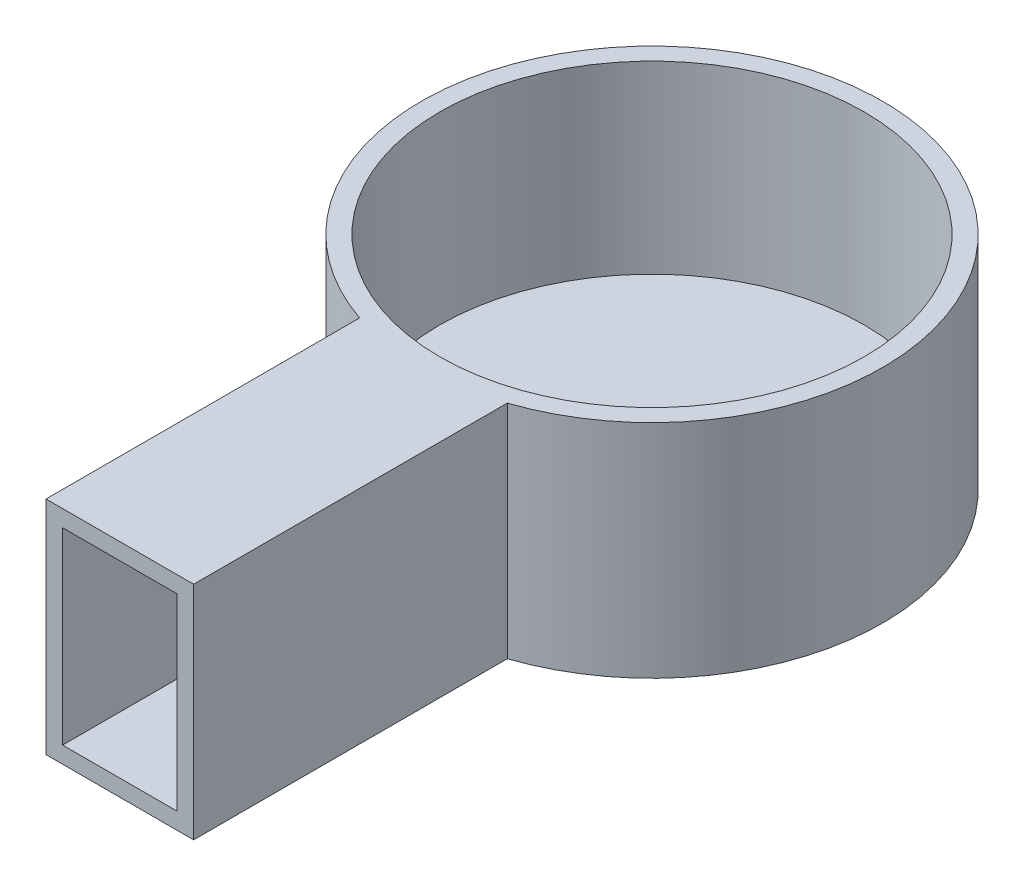
ISO-10303-21;
HEADER;
FILE_DESCRIPTION(('STEP AP214'),'2;1');
FILE_NAME('part.step','',(''),(''),'','','');
FILE_SCHEMA(('AUTOMOTIVE_DESIGN { 1 0 10303 214 1 1 1 1 }'));
ENDSEC;
DATA;
#1=APPLICATION_CONTEXT('core data for automotive mechanical design processes');
#2=APPLICATION_PROTOCOL_DEFINITION('international standard','automotive_design',2000,#1);
#3=PRODUCT_CONTEXT('',#1,'mechanical');
#4=PRODUCT('Part','Part','',(#3));
#5=PRODUCT_RELATED_PRODUCT_CATEGORY('part','',(#4));
#6=PRODUCT_DEFINITION_FORMATION('','',#4);
#7=PRODUCT_DEFINITION_CONTEXT('part definition',#1,'design');
#8=PRODUCT_DEFINITION('design','',#6,#7);
#9=PRODUCT_DEFINITION_SHAPE('','',#8);
#10=(LENGTH_UNIT() NAMED_UNIT(*) SI_UNIT(.MILLI.,.METRE.));
#11=(NAMED_UNIT(*) PLANE_ANGLE_UNIT() SI_UNIT($,.RADIAN.));
#12=(NAMED_UNIT(*) SI_UNIT($,.STERADIAN.) SOLID_ANGLE_UNIT());
#13=UNCERTAINTY_MEASURE_WITH_UNIT(LENGTH_MEASURE(1.E-05),#10,'distance_accuracy_value','');
#14=(GEOMETRIC_REPRESENTATION_CONTEXT(3) GLOBAL_UNCERTAINTY_ASSIGNED_CONTEXT((#13)) GLOBAL_UNIT_ASSIGNED_CONTEXT((#10,
#11,#12)) REPRESENTATION_CONTEXT('',''));
#15=CARTESIAN_POINT('',(0.,0.,0.));
#16=DIRECTION('',(0.,0.,1.));
#17=DIRECTION('',(1.,0.,0.));
#18=AXIS2_PLACEMENT_3D('',#15,#16,#17);
#19=CARTESIAN_POINT('',(-4.,-6.,17.));
#20=DIRECTION('',(1.,0.,0.));
#21=DIRECTION('',(0.,0.,-1.));
#22=AXIS2_PLACEMENT_3D('',#19,#20,#21);
#23=PLANE('',#22);
#24=DIRECTION('',(0.,-1.,0.));
#25=VECTOR('',#24,1.);
#26=CARTESIAN_POINT('',(-4.,-6.,0.));
#27=LINE('',#26,#25);
#28=CARTESIAN_POINT('',(-4.,6.,0.));
#29=VERTEX_POINT('',#28);
#30=CARTESIAN_POINT('',(-4.,-6.,0.));
#31=VERTEX_POINT('',#30);
#32=EDGE_CURVE('E121',#29,#31,#27,.T.);
#33=ORIENTED_EDGE('',*,*,#32,.T.);
#34=DIRECTION('',(0.,0.,-1.));
#35=VECTOR('',#34,1.);
#36=CARTESIAN_POINT('',(-4.,-6.,17.));
#37=LINE('',#36,#35);
#38=CARTESIAN_POINT('',(-4.,-6.,17.));
#39=VERTEX_POINT('',#38);
#40=EDGE_CURVE('E11',#39,#31,#37,.T.);
#41=ORIENTED_EDGE('',*,*,#40,.F.);
#42=DIRECTION('',(0.,-1.,0.));
#43=VECTOR('',#42,1.);
#44=CARTESIAN_POINT('',(-4.,-6.,17.));
#45=LINE('',#44,#43);
#46=CARTESIAN_POINT('',(-4.,6.,17.));
#47=VERTEX_POINT('',#46);
#48=EDGE_CURVE('E103',#47,#39,#45,.T.);
#49=ORIENTED_EDGE('',*,*,#48,.F.);
#50=DIRECTION('',(0.,0.,-1.));
#51=VECTOR('',#50,1.);
#52=CARTESIAN_POINT('',(-4.,6.,17.));
#53=LINE('',#52,#51);
#54=EDGE_CURVE('E117',#47,#29,#53,.T.);
#55=ORIENTED_EDGE('',*,*,#54,.T.);
#56=EDGE_LOOP('',(#33,#41,#49,#55));
#57=FACE_BOUND('',#56,.T.);
#58=ADVANCED_FACE('F34',(#57),#23,.F.);
#59=CARTESIAN_POINT('',(4.,-6.,17.));
#60=DIRECTION('',(0.,1.,0.));
#61=DIRECTION('',(-1.,0.,0.));
#62=AXIS2_PLACEMENT_3D('',#59,#60,#61);
#63=PLANE('',#62);
#64=ORIENTED_EDGE('',*,*,#40,.T.);
#65=CARTESIAN_POINT('',(0.,-6.,-11.842719282327));
#66=DIRECTION('',(0.,1.,0.));
#67=DIRECTION('',(-1.,0.,0.));
#68=AXIS2_PLACEMENT_3D('',#65,#66,#67);
#69=CIRCLE('',#68,12.5);
#70=CARTESIAN_POINT('',(4.,-6.,0.));
#71=VERTEX_POINT('',#70);
#72=EDGE_CURVE('E111',#71,#31,#69,.T.);
#73=ORIENTED_EDGE('',*,*,#72,.F.);
#74=DIRECTION('',(0.,0.,-1.));
#75=VECTOR('',#74,1.);
#76=CARTESIAN_POINT('',(4.,-6.,17.));
#77=LINE('',#76,#75);
#78=CARTESIAN_POINT('',(4.,-6.,17.));
#79=VERTEX_POINT('',#78);
#80=EDGE_CURVE('E41',#79,#71,#77,.T.);
#81=ORIENTED_EDGE('',*,*,#80,.F.);
#82=DIRECTION('',(1.,0.,0.));
#83=VECTOR('',#82,1.);
#84=CARTESIAN_POINT('',(4.,-6.,17.));
#85=LINE('',#84,#83);
#86=EDGE_CURVE('E96',#39,#79,#85,.T.);
#87=ORIENTED_EDGE('',*,*,#86,.F.);
#88=EDGE_LOOP('',(#64,#73,#81,#87));
#89=FACE_BOUND('',#88,.T.);
#90=ADVANCED_FACE('F109',(#89),#63,.F.);
#91=CARTESIAN_POINT('',(4.,-6.,17.));
#92=DIRECTION('',(-1.,0.,0.));
#93=DIRECTION('',(0.,0.,1.));
#94=AXIS2_PLACEMENT_3D('',#91,#92,#93);
#95=PLANE('',#94);
#96=DIRECTION('',(0.,1.,0.));
#97=VECTOR('',#96,1.);
#98=CARTESIAN_POINT('',(4.,-6.,0.));
#99=LINE('',#98,#97);
#100=CARTESIAN_POINT('',(4.,6.,0.));
#101=VERTEX_POINT('',#100);
#102=EDGE_CURVE('E124',#71,#101,#99,.T.);
#103=ORIENTED_EDGE('',*,*,#102,.T.);
#104=DIRECTION('',(0.,0.,-1.));
#105=VECTOR('',#104,1.);
#106=CARTESIAN_POINT('',(4.,6.,17.));
#107=LINE('',#106,#105);
#108=CARTESIAN_POINT('',(4.,6.,17.));
#109=VERTEX_POINT('',#108);
#110=EDGE_CURVE('E114',#109,#101,#107,.T.);
#111=ORIENTED_EDGE('',*,*,#110,.F.);
#112=DIRECTION('',(0.,1.,0.));
#113=VECTOR('',#112,1.);
#114=CARTESIAN_POINT('',(4.,-6.,17.));
#115=LINE('',#114,#113);
#116=EDGE_CURVE('E100',#79,#109,#115,.T.);
#117=ORIENTED_EDGE('',*,*,#116,.F.);
#118=ORIENTED_EDGE('',*,*,#80,.T.);
#119=EDGE_LOOP('',(#103,#111,#117,#118));
#120=FACE_BOUND('',#119,.T.);
#121=ADVANCED_FACE('F115',(#120),#95,.F.);
#122=CARTESIAN_POINT('',(4.,6.,17.));
#123=DIRECTION('',(0.,-1.,0.));
#124=DIRECTION('',(1.,0.,0.));
#125=AXIS2_PLACEMENT_3D('',#122,#123,#124);
#126=PLANE('',#125);
#127=CARTESIAN_POINT('',(0.,6.,-11.842719282327));
#128=DIRECTION('',(0.,1.,0.));
#129=DIRECTION('',(-1.,0.,0.));
#130=AXIS2_PLACEMENT_3D('',#127,#128,#129);
#131=CIRCLE('',#130,11.5);
#132=CARTESIAN_POINT('',(-11.5,6.,-11.842719282327));
#133=VERTEX_POINT('',#132);
#134=EDGE_CURVE('E199',#133,#133,#131,.T.);
#135=ORIENTED_EDGE('',*,*,#134,.F.);
#136=EDGE_LOOP('',(#135));
#137=FACE_BOUND('',#136,.T.);
#138=ORIENTED_EDGE('',*,*,#110,.T.);
#139=CARTESIAN_POINT('',(0.,6.,-11.842719282327));
#140=DIRECTION('',(0.,1.,0.));
#141=DIRECTION('',(-1.,0.,0.));
#142=AXIS2_PLACEMENT_3D('',#139,#140,#141);
#143=CIRCLE('',#142,12.5);
#144=EDGE_CURVE('E69',#101,#29,#143,.T.);
#145=ORIENTED_EDGE('',*,*,#144,.T.);
#146=ORIENTED_EDGE('',*,*,#54,.F.);
#147=DIRECTION('',(-1.,0.,0.));
#148=VECTOR('',#147,1.);
#149=CARTESIAN_POINT('',(4.,6.,17.));
#150=LINE('',#149,#148);
#151=EDGE_CURVE('E57',#109,#47,#150,.T.);
#152=ORIENTED_EDGE('',*,*,#151,.F.);
#153=EDGE_LOOP('',(#138,#145,#146,#152));
#154=FACE_BOUND('',#153,.T.);
#155=ADVANCED_FACE('F129',(#137,#154),#126,.F.);
#156=CARTESIAN_POINT('',(0.,0.,17.));
#157=DIRECTION('',(0.,0.,1.));
#158=DIRECTION('',(1.,0.,0.));
#159=AXIS2_PLACEMENT_3D('',#156,#157,#158);
#160=PLANE('',#159);
#161=DIRECTION('',(0.,-1.,0.));
#162=VECTOR('',#161,1.);
#163=CARTESIAN_POINT('',(-3.1,-5.1,17.));
#164=LINE('',#163,#162);
#165=CARTESIAN_POINT('',(-3.1,5.1,17.));
#166=VERTEX_POINT('',#165);
#167=CARTESIAN_POINT('',(-3.1,-5.1,17.));
#168=VERTEX_POINT('',#167);
#169=EDGE_CURVE('E48',#166,#168,#164,.T.);
#170=ORIENTED_EDGE('',*,*,#169,.F.);
#171=DIRECTION('',(-1.,0.,0.));
#172=VECTOR('',#171,1.);
#173=CARTESIAN_POINT('',(3.1,5.1,17.));
#174=LINE('',#173,#172);
#175=CARTESIAN_POINT('',(3.1,5.1,17.));
#176=VERTEX_POINT('',#175);
#177=EDGE_CURVE('E165',#176,#166,#174,.T.);
#178=ORIENTED_EDGE('',*,*,#177,.F.);
#179=DIRECTION('',(0.,1.,0.));
#180=VECTOR('',#179,1.);
#181=CARTESIAN_POINT('',(3.1,-5.1,17.));
#182=LINE('',#181,#180);
#183=CARTESIAN_POINT('',(3.1,-5.1,17.));
#184=VERTEX_POINT('',#183);
#185=EDGE_CURVE('E172',#184,#176,#182,.T.);
#186=ORIENTED_EDGE('',*,*,#185,.F.);
#187=DIRECTION('',(1.,0.,0.));
#188=VECTOR('',#187,1.);
#189=CARTESIAN_POINT('',(3.1,-5.1,17.));
#190=LINE('',#189,#188);
#191=EDGE_CURVE('E148',#168,#184,#190,.T.);
#192=ORIENTED_EDGE('',*,*,#191,.F.);
#193=EDGE_LOOP('',(#170,#178,#186,#192));
#194=FACE_BOUND('',#193,.T.);
#195=ORIENTED_EDGE('',*,*,#48,.T.);
#196=ORIENTED_EDGE('',*,*,#86,.T.);
#197=ORIENTED_EDGE('',*,*,#116,.T.);
#198=ORIENTED_EDGE('',*,*,#151,.T.);
#199=EDGE_LOOP('',(#195,#196,#197,#198));
#200=FACE_BOUND('',#199,.T.);
#201=ADVANCED_FACE('F98',(#194,#200),#160,.T.);
#202=CARTESIAN_POINT('',(-3.1,-5.1,2.));
#203=DIRECTION('',(-1.,0.,0.));
#204=DIRECTION('',(0.,0.,1.));
#205=AXIS2_PLACEMENT_3D('',#202,#203,#204);
#206=PLANE('',#205);
#207=ORIENTED_EDGE('',*,*,#169,.T.);
#208=DIRECTION('',(0.,0.,1.));
#209=VECTOR('',#208,1.);
#210=CARTESIAN_POINT('',(-3.1,-5.1,2.));
#211=LINE('',#210,#209);
#212=CARTESIAN_POINT('',(-3.1,-5.1,2.));
#213=VERTEX_POINT('',#212);
#214=EDGE_CURVE('E153',#213,#168,#211,.T.);
#215=ORIENTED_EDGE('',*,*,#214,.F.);
#216=DIRECTION('',(0.,-1.,0.));
#217=VECTOR('',#216,1.);
#218=CARTESIAN_POINT('',(-3.1,-5.1,2.));
#219=LINE('',#218,#217);
#220=CARTESIAN_POINT('',(-3.1,5.1,2.));
#221=VERTEX_POINT('',#220);
#222=EDGE_CURVE('E163',#221,#213,#219,.T.);
#223=ORIENTED_EDGE('',*,*,#222,.F.);
#224=DIRECTION('',(0.,0.,1.));
#225=VECTOR('',#224,1.);
#226=CARTESIAN_POINT('',(-3.1,5.1,2.));
#227=LINE('',#226,#225);
#228=EDGE_CURVE('E79',#221,#166,#227,.T.);
#229=ORIENTED_EDGE('',*,*,#228,.T.);
#230=EDGE_LOOP('',(#207,#215,#223,#229));
#231=FACE_BOUND('',#230,.T.);
#232=ADVANCED_FACE('F181',(#231),#206,.F.);
#233=CARTESIAN_POINT('',(3.1,5.1,2.));
#234=DIRECTION('',(0.,1.,0.));
#235=DIRECTION('',(0.,0.,1.));
#236=AXIS2_PLACEMENT_3D('',#233,#234,#235);
#237=PLANE('',#236);
#238=ORIENTED_EDGE('',*,*,#177,.T.);
#239=ORIENTED_EDGE('',*,*,#228,.F.);
#240=DIRECTION('',(-1.,0.,0.));
#241=VECTOR('',#240,1.);
#242=CARTESIAN_POINT('',(3.1,5.1,2.));
#243=LINE('',#242,#241);
#244=CARTESIAN_POINT('',(3.1,5.1,2.));
#245=VERTEX_POINT('',#244);
#246=EDGE_CURVE('E160',#245,#221,#243,.T.);
#247=ORIENTED_EDGE('',*,*,#246,.F.);
#248=DIRECTION('',(0.,0.,1.));
#249=VECTOR('',#248,1.);
#250=CARTESIAN_POINT('',(3.1,5.1,2.));
#251=LINE('',#250,#249);
#252=EDGE_CURVE('E152',#245,#176,#251,.T.);
#253=ORIENTED_EDGE('',*,*,#252,.T.);
#254=EDGE_LOOP('',(#238,#239,#247,#253));
#255=FACE_BOUND('',#254,.T.);
#256=ADVANCED_FACE('F179',(#255),#237,.F.);
#257=CARTESIAN_POINT('',(3.1,-5.1,2.));
#258=DIRECTION('',(1.,0.,0.));
#259=DIRECTION('',(0.,0.,-1.));
#260=AXIS2_PLACEMENT_3D('',#257,#258,#259);
#261=PLANE('',#260);
#262=ORIENTED_EDGE('',*,*,#185,.T.);
#263=ORIENTED_EDGE('',*,*,#252,.F.);
#264=DIRECTION('',(0.,1.,0.));
#265=VECTOR('',#264,1.);
#266=CARTESIAN_POINT('',(3.1,-5.1,2.));
#267=LINE('',#266,#265);
#268=CARTESIAN_POINT('',(3.1,-5.1,2.));
#269=VERTEX_POINT('',#268);
#270=EDGE_CURVE('E156',#269,#245,#267,.T.);
#271=ORIENTED_EDGE('',*,*,#270,.F.);
#272=DIRECTION('',(0.,0.,1.));
#273=VECTOR('',#272,1.);
#274=CARTESIAN_POINT('',(3.1,-5.1,2.));
#275=LINE('',#274,#273);
#276=EDGE_CURVE('E141',#269,#184,#275,.T.);
#277=ORIENTED_EDGE('',*,*,#276,.T.);
#278=EDGE_LOOP('',(#262,#263,#271,#277));
#279=FACE_BOUND('',#278,.T.);
#280=ADVANCED_FACE('F157',(#279),#261,.F.);
#281=CARTESIAN_POINT('',(3.1,-5.1,2.));
#282=DIRECTION('',(0.,-1.,0.));
#283=DIRECTION('',(1.,0.,0.));
#284=AXIS2_PLACEMENT_3D('',#281,#282,#283);
#285=PLANE('',#284);
#286=ORIENTED_EDGE('',*,*,#191,.T.);
#287=ORIENTED_EDGE('',*,*,#276,.F.);
#288=DIRECTION('',(1.,0.,0.));
#289=VECTOR('',#288,1.);
#290=CARTESIAN_POINT('',(3.1,-5.1,2.));
#291=LINE('',#290,#289);
#292=EDGE_CURVE('E145',#213,#269,#291,.T.);
#293=ORIENTED_EDGE('',*,*,#292,.F.);
#294=ORIENTED_EDGE('',*,*,#214,.T.);
#295=EDGE_LOOP('',(#286,#287,#293,#294));
#296=FACE_BOUND('',#295,.T.);
#297=ADVANCED_FACE('F143',(#296),#285,.F.);
#298=CARTESIAN_POINT('',(0.,0.,2.));
#299=DIRECTION('',(0.,0.,1.));
#300=DIRECTION('',(1.,0.,0.));
#301=AXIS2_PLACEMENT_3D('',#298,#299,#300);
#302=PLANE('',#301);
#303=ORIENTED_EDGE('',*,*,#222,.T.);
#304=ORIENTED_EDGE('',*,*,#292,.T.);
#305=ORIENTED_EDGE('',*,*,#270,.T.);
#306=ORIENTED_EDGE('',*,*,#246,.T.);
#307=EDGE_LOOP('',(#303,#304,#305,#306));
#308=FACE_BOUND('',#307,.T.);
#309=ADVANCED_FACE('F162',(#308),#302,.T.);
#310=CARTESIAN_POINT('',(0.,-6.,-11.842719282327));
#311=DIRECTION('',(0.,1.,0.));
#312=DIRECTION('',(-1.,0.,0.));
#313=AXIS2_PLACEMENT_3D('',#310,#311,#312);
#314=CYLINDRICAL_SURFACE('',#313,12.5);
#315=ORIENTED_EDGE('',*,*,#102,.F.);
#316=ORIENTED_EDGE('',*,*,#72,.T.);
#317=ORIENTED_EDGE('',*,*,#32,.F.);
#318=ORIENTED_EDGE('',*,*,#144,.F.);
#319=EDGE_LOOP('',(#315,#316,#317,#318));
#320=FACE_BOUND('',#319,.T.);
#321=ADVANCED_FACE('F195',(#320),#314,.T.);
#322=CARTESIAN_POINT('',(0.,-4.,-11.842719282327));
#323=DIRECTION('',(0.,1.,0.));
#324=DIRECTION('',(-1.,0.,0.));
#325=AXIS2_PLACEMENT_3D('',#322,#323,#324);
#326=CYLINDRICAL_SURFACE('',#325,11.5);
#327=CARTESIAN_POINT('',(0.,-4.,-11.842719282327));
#328=DIRECTION('',(0.,1.,0.));
#329=DIRECTION('',(-1.,0.,0.));
#330=AXIS2_PLACEMENT_3D('',#327,#328,#329);
#331=CIRCLE('',#330,11.5);
#332=CARTESIAN_POINT('',(-11.5,-4.,-11.842719282327));
#333=VERTEX_POINT('',#332);
#334=EDGE_CURVE('E197',#333,#333,#331,.T.);
#335=ORIENTED_EDGE('',*,*,#334,.F.);
#336=EDGE_LOOP('',(#335));
#337=FACE_BOUND('',#336,.T.);
#338=ORIENTED_EDGE('',*,*,#134,.T.);
#339=EDGE_LOOP('',(#338));
#340=FACE_BOUND('',#339,.T.);
#341=ADVANCED_FACE('F207',(#337,#340),#326,.F.);
#342=CARTESIAN_POINT('',(0.,-4.,-11.842719282327));
#343=DIRECTION('',(0.,1.,0.));
#344=DIRECTION('',(-1.,0.,0.));
#345=AXIS2_PLACEMENT_3D('',#342,#343,#344);
#346=PLANE('',#345);
#347=ORIENTED_EDGE('',*,*,#334,.T.);
#348=EDGE_LOOP('',(#347));
#349=FACE_BOUND('',#348,.T.);
#350=ADVANCED_FACE('F205',(#349),#346,.T.);
#351=CLOSED_SHELL('',(#58,#90,#121,#155,#201,#232,#256,#280,#297,#309,#321,#341,#350));
#352=MANIFOLD_SOLID_BREP('B2',#351);
#353=ADVANCED_BREP_SHAPE_REPRESENTATION('',(#18,#352),#14);
#354=SHAPE_DEFINITION_REPRESENTATION(#9,#353);
ENDSEC;
END-ISO-10303-21;
